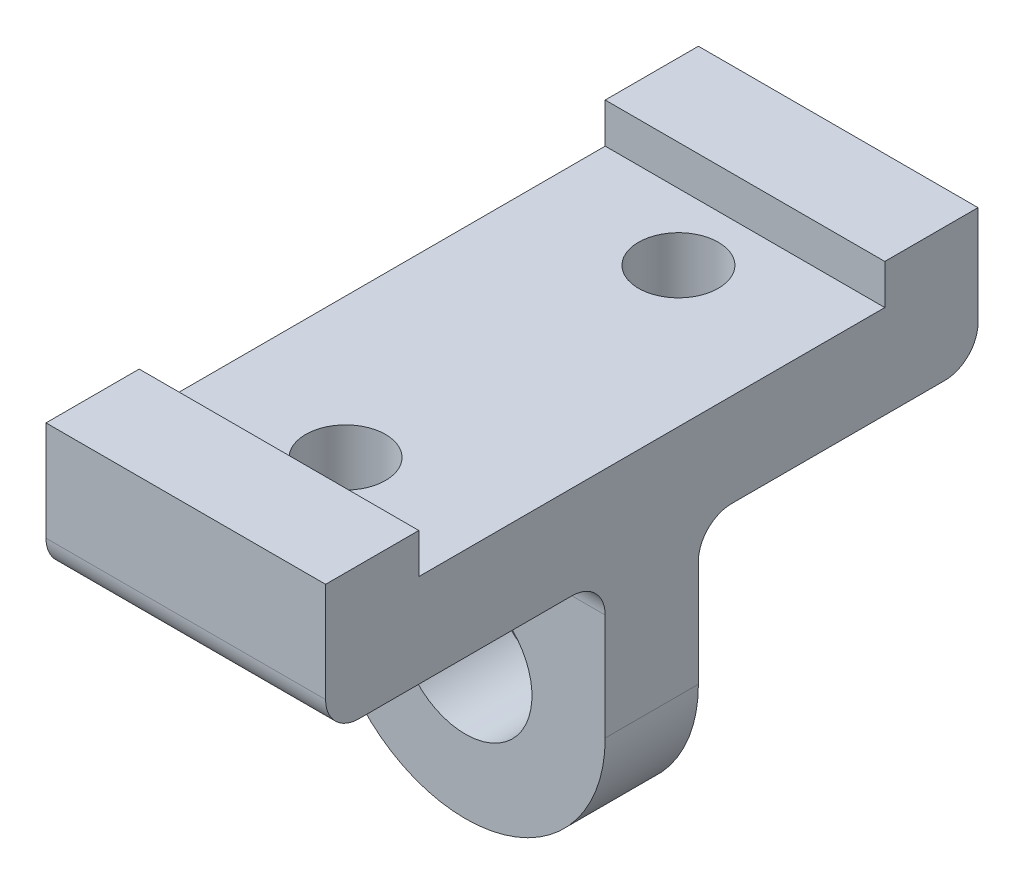
ISO-10303-21;
HEADER;
FILE_DESCRIPTION(('STEP AP214'),'2;1');
FILE_NAME('part.step','',(''),(''),'','','');
FILE_SCHEMA(('AUTOMOTIVE_DESIGN { 1 0 10303 214 1 1 1 1 }'));
ENDSEC;
DATA;
#1=APPLICATION_CONTEXT('core data for automotive mechanical design processes');
#2=APPLICATION_PROTOCOL_DEFINITION('international standard','automotive_design',2000,#1);
#3=PRODUCT_CONTEXT('',#1,'mechanical');
#4=PRODUCT('Part','Part','',(#3));
#5=PRODUCT_RELATED_PRODUCT_CATEGORY('part','',(#4));
#6=PRODUCT_DEFINITION_FORMATION('','',#4);
#7=PRODUCT_DEFINITION_CONTEXT('part definition',#1,'design');
#8=PRODUCT_DEFINITION('design','',#6,#7);
#9=PRODUCT_DEFINITION_SHAPE('','',#8);
#10=(LENGTH_UNIT() NAMED_UNIT(*) SI_UNIT(.MILLI.,.METRE.));
#11=(NAMED_UNIT(*) PLANE_ANGLE_UNIT() SI_UNIT($,.RADIAN.));
#12=(NAMED_UNIT(*) SI_UNIT($,.STERADIAN.) SOLID_ANGLE_UNIT());
#13=UNCERTAINTY_MEASURE_WITH_UNIT(LENGTH_MEASURE(1.E-05),#10,'distance_accuracy_value','');
#14=(GEOMETRIC_REPRESENTATION_CONTEXT(3) GLOBAL_UNCERTAINTY_ASSIGNED_CONTEXT((#13)) GLOBAL_UNIT_ASSIGNED_CONTEXT((#10,
#11,#12)) REPRESENTATION_CONTEXT('',''));
#15=CARTESIAN_POINT('',(0.,0.,0.));
#16=DIRECTION('',(0.,0.,1.));
#17=DIRECTION('',(1.,0.,0.));
#18=AXIS2_PLACEMENT_3D('',#15,#16,#17);
#19=CARTESIAN_POINT('',(0.,0.,0.));
#20=DIRECTION('',(0.,1.,0.));
#21=DIRECTION('',(0.,0.,1.));
#22=AXIS2_PLACEMENT_3D('',#19,#20,#21);
#23=PLANE('',#22);
#24=CARTESIAN_POINT('',(0.,0.,25.));
#25=DIRECTION('',(0.,-1.,0.));
#26=DIRECTION('',(0.,0.,-1.));
#27=AXIS2_PLACEMENT_3D('',#24,#25,#26);
#28=CIRCLE('',#27,6.);
#29=CARTESIAN_POINT('',(0.,0.,19.));
#30=VERTEX_POINT('',#29);
#31=EDGE_CURVE('E244',#30,#30,#28,.T.);
#32=ORIENTED_EDGE('',*,*,#31,.F.);
#33=EDGE_LOOP('',(#32));
#34=FACE_BOUND('',#33,.T.);
#35=DIRECTION('',(0.,0.,1.));
#36=VECTOR('',#35,1.);
#37=CARTESIAN_POINT('',(-21.,0.,49.));
#38=LINE('',#37,#36);
#39=CARTESIAN_POINT('',(-21.,0.,12.));
#40=VERTEX_POINT('',#39);
#41=CARTESIAN_POINT('',(-21.,0.,44.));
#42=VERTEX_POINT('',#41);
#43=EDGE_CURVE('E202',#40,#42,#38,.T.);
#44=ORIENTED_EDGE('',*,*,#43,.F.);
#45=DIRECTION('',(-1.,0.,0.));
#46=VECTOR('',#45,1.);
#47=CARTESIAN_POINT('',(21.,0.,12.));
#48=LINE('',#47,#46);
#49=CARTESIAN_POINT('',(21.,0.,12.));
#50=VERTEX_POINT('',#49);
#51=EDGE_CURVE('E249',#40,#50,#48,.F.);
#52=ORIENTED_EDGE('',*,*,#51,.T.);
#53=DIRECTION('',(0.,0.,-1.));
#54=VECTOR('',#53,1.);
#55=CARTESIAN_POINT('',(21.,0.,49.));
#56=LINE('',#55,#54);
#57=CARTESIAN_POINT('',(21.,0.,44.));
#58=VERTEX_POINT('',#57);
#59=EDGE_CURVE('E204',#58,#50,#56,.T.);
#60=ORIENTED_EDGE('',*,*,#59,.F.);
#61=DIRECTION('',(1.,0.,0.));
#62=VECTOR('',#61,1.);
#63=CARTESIAN_POINT('',(0.,0.,44.));
#64=LINE('',#63,#62);
#65=EDGE_CURVE('E247',#58,#42,#64,.F.);
#66=ORIENTED_EDGE('',*,*,#65,.T.);
#67=EDGE_LOOP('',(#44,#52,#60,#66));
#68=FACE_BOUND('',#67,.T.);
#69=ADVANCED_FACE('F33',(#34,#68),#23,.F.);
#70=CARTESIAN_POINT('',(0.,0.,-25.));
#71=DIRECTION('',(0.,1.,0.));
#72=DIRECTION('',(0.,0.,1.));
#73=AXIS2_PLACEMENT_3D('',#70,#71,#72);
#74=CIRCLE('',#73,6.);
#75=CARTESIAN_POINT('',(0.,0.,-31.));
#76=VERTEX_POINT('',#75);
#77=EDGE_CURVE('E240',#76,#76,#74,.T.);
#78=ORIENTED_EDGE('',*,*,#77,.T.);
#79=EDGE_LOOP('',(#78));
#80=FACE_BOUND('',#79,.T.);
#81=CARTESIAN_POINT('',(21.,0.,-12.));
#82=VERTEX_POINT('',#81);
#83=CARTESIAN_POINT('',(21.,0.,-44.));
#84=VERTEX_POINT('',#83);
#85=EDGE_CURVE('E201',#82,#84,#56,.T.);
#86=ORIENTED_EDGE('',*,*,#85,.F.);
#87=DIRECTION('',(1.,0.,0.));
#88=VECTOR('',#87,1.);
#89=CARTESIAN_POINT('',(-21.,0.,-12.));
#90=LINE('',#89,#88);
#91=CARTESIAN_POINT('',(-21.,0.,-12.));
#92=VERTEX_POINT('',#91);
#93=EDGE_CURVE('E256',#82,#92,#90,.F.);
#94=ORIENTED_EDGE('',*,*,#93,.T.);
#95=CARTESIAN_POINT('',(-21.,0.,-44.));
#96=VERTEX_POINT('',#95);
#97=EDGE_CURVE('E198',#96,#92,#38,.T.);
#98=ORIENTED_EDGE('',*,*,#97,.F.);
#99=DIRECTION('',(-1.,0.,0.));
#100=VECTOR('',#99,1.);
#101=CARTESIAN_POINT('',(0.,0.,-44.));
#102=LINE('',#101,#100);
#103=EDGE_CURVE('E254',#96,#84,#102,.F.);
#104=ORIENTED_EDGE('',*,*,#103,.T.);
#105=EDGE_LOOP('',(#86,#94,#98,#104));
#106=FACE_BOUND('',#105,.T.);
#107=ADVANCED_FACE('F281',(#80,#106),#23,.F.);
#108=CARTESIAN_POINT('',(0.,20.,0.));
#109=DIRECTION('',(0.,1.,0.));
#110=DIRECTION('',(0.,0.,1.));
#111=AXIS2_PLACEMENT_3D('',#108,#109,#110);
#112=PLANE('',#111);
#113=DIRECTION('',(-1.,0.,0.));
#114=VECTOR('',#113,1.);
#115=CARTESIAN_POINT('',(21.,20.,-35.));
#116=LINE('',#115,#114);
#117=CARTESIAN_POINT('',(21.,20.,-35.));
#118=VERTEX_POINT('',#117);
#119=CARTESIAN_POINT('',(-21.,20.,-35.));
#120=VERTEX_POINT('',#119);
#121=EDGE_CURVE('E173',#118,#120,#116,.T.);
#122=ORIENTED_EDGE('',*,*,#121,.F.);
#123=DIRECTION('',(0.,0.,-1.));
#124=VECTOR('',#123,1.);
#125=CARTESIAN_POINT('',(21.,20.,49.));
#126=LINE('',#125,#124);
#127=CARTESIAN_POINT('',(21.,20.,-49.));
#128=VERTEX_POINT('',#127);
#129=EDGE_CURVE('E191',#118,#128,#126,.T.);
#130=ORIENTED_EDGE('',*,*,#129,.T.);
#131=DIRECTION('',(-1.,0.,0.));
#132=VECTOR('',#131,1.);
#133=CARTESIAN_POINT('',(21.,20.,-49.));
#134=LINE('',#133,#132);
#135=CARTESIAN_POINT('',(-21.,20.,-49.));
#136=VERTEX_POINT('',#135);
#137=EDGE_CURVE('E195',#128,#136,#134,.T.);
#138=ORIENTED_EDGE('',*,*,#137,.T.);
#139=DIRECTION('',(0.,0.,1.));
#140=VECTOR('',#139,1.);
#141=CARTESIAN_POINT('',(-21.,20.,49.));
#142=LINE('',#141,#140);
#143=EDGE_CURVE('E186',#136,#120,#142,.T.);
#144=ORIENTED_EDGE('',*,*,#143,.T.);
#145=EDGE_LOOP('',(#122,#130,#138,#144));
#146=FACE_BOUND('',#145,.T.);
#147=ADVANCED_FACE('F308',(#146),#112,.T.);
#148=CARTESIAN_POINT('',(-21.,20.,49.));
#149=DIRECTION('',(1.,0.,0.));
#150=DIRECTION('',(0.,0.,-1.));
#151=AXIS2_PLACEMENT_3D('',#148,#149,#150);
#152=PLANE('',#151);
#153=ORIENTED_EDGE('',*,*,#43,.T.);
#154=CARTESIAN_POINT('',(-21.,5.,44.));
#155=DIRECTION('',(1.,0.,0.));
#156=DIRECTION('',(0.,0.,-1.));
#157=AXIS2_PLACEMENT_3D('',#154,#155,#156);
#158=CIRCLE('',#157,5.);
#159=CARTESIAN_POINT('',(-21.,5.,49.));
#160=VERTEX_POINT('',#159);
#161=EDGE_CURVE('E265',#42,#160,#158,.F.);
#162=ORIENTED_EDGE('',*,*,#161,.T.);
#163=DIRECTION('',(0.,-1.,0.));
#164=VECTOR('',#163,1.);
#165=CARTESIAN_POINT('',(-21.,20.,49.));
#166=LINE('',#165,#164);
#167=CARTESIAN_POINT('',(-21.,20.,49.));
#168=VERTEX_POINT('',#167);
#169=EDGE_CURVE('E212',#168,#160,#166,.T.);
#170=ORIENTED_EDGE('',*,*,#169,.F.);
#171=CARTESIAN_POINT('',(-21.,20.,35.0000000000001));
#172=VERTEX_POINT('',#171);
#173=EDGE_CURVE('E179',#172,#168,#142,.T.);
#174=ORIENTED_EDGE('',*,*,#173,.F.);
#175=DIRECTION('',(0.,1.,0.));
#176=VECTOR('',#175,1.);
#177=CARTESIAN_POINT('',(-21.,14.,35.0000000000001));
#178=LINE('',#177,#176);
#179=CARTESIAN_POINT('',(-21.,14.,35.0000000000001));
#180=VERTEX_POINT('',#179);
#181=EDGE_CURVE('E157',#180,#172,#178,.T.);
#182=ORIENTED_EDGE('',*,*,#181,.F.);
#183=DIRECTION('',(0.,0.,1.));
#184=VECTOR('',#183,1.);
#185=CARTESIAN_POINT('',(-21.,14.,35.0000000000001));
#186=LINE('',#185,#184);
#187=CARTESIAN_POINT('',(-21.,14.,-35.));
#188=VERTEX_POINT('',#187);
#189=EDGE_CURVE('E164',#188,#180,#186,.T.);
#190=ORIENTED_EDGE('',*,*,#189,.F.);
#191=DIRECTION('',(0.,1.,0.));
#192=VECTOR('',#191,1.);
#193=CARTESIAN_POINT('',(-21.,14.,-35.));
#194=LINE('',#193,#192);
#195=EDGE_CURVE('E301',#188,#120,#194,.T.);
#196=ORIENTED_EDGE('',*,*,#195,.T.);
#197=ORIENTED_EDGE('',*,*,#143,.F.);
#198=DIRECTION('',(0.,-1.,0.));
#199=VECTOR('',#198,1.);
#200=CARTESIAN_POINT('',(-21.,20.,-49.));
#201=LINE('',#200,#199);
#202=CARTESIAN_POINT('',(-21.,5.,-49.));
#203=VERTEX_POINT('',#202);
#204=EDGE_CURVE('E197',#136,#203,#201,.T.);
#205=ORIENTED_EDGE('',*,*,#204,.T.);
#206=CARTESIAN_POINT('',(-21.,5.,-44.));
#207=DIRECTION('',(1.,0.,0.));
#208=DIRECTION('',(0.,0.,-1.));
#209=AXIS2_PLACEMENT_3D('',#206,#207,#208);
#210=CIRCLE('',#209,5.);
#211=EDGE_CURVE('E48',#203,#96,#210,.F.);
#212=ORIENTED_EDGE('',*,*,#211,.T.);
#213=ORIENTED_EDGE('',*,*,#97,.T.);
#214=CARTESIAN_POINT('',(-21.,-5.,-12.));
#215=DIRECTION('',(1.,0.,0.));
#216=DIRECTION('',(0.,0.,-1.));
#217=AXIS2_PLACEMENT_3D('',#214,#215,#216);
#218=CIRCLE('',#217,5.);
#219=CARTESIAN_POINT('',(-21.,-5.00000000000001,-7.));
#220=VERTEX_POINT('',#219);
#221=EDGE_CURVE('E11',#92,#220,#218,.T.);
#222=ORIENTED_EDGE('',*,*,#221,.T.);
#223=DIRECTION('',(0.,1.,0.));
#224=VECTOR('',#223,1.);
#225=CARTESIAN_POINT('',(-21.,-42.,-7.));
#226=LINE('',#225,#224);
#227=CARTESIAN_POINT('',(-21.,-21.,-7.));
#228=VERTEX_POINT('',#227);
#229=EDGE_CURVE('E287',#228,#220,#226,.T.);
#230=ORIENTED_EDGE('',*,*,#229,.F.);
#231=DIRECTION('',(0.,0.,-1.));
#232=VECTOR('',#231,1.);
#233=CARTESIAN_POINT('',(-21.,-21.,7.));
#234=LINE('',#233,#232);
#235=CARTESIAN_POINT('',(-21.,-21.,7.));
#236=VERTEX_POINT('',#235);
#237=EDGE_CURVE('E226',#228,#236,#234,.F.);
#238=ORIENTED_EDGE('',*,*,#237,.T.);
#239=DIRECTION('',(0.,1.,0.));
#240=VECTOR('',#239,1.);
#241=CARTESIAN_POINT('',(-21.,-42.,7.));
#242=LINE('',#241,#240);
#243=CARTESIAN_POINT('',(-21.,-5.00000000000001,7.));
#244=VERTEX_POINT('',#243);
#245=EDGE_CURVE('E232',#236,#244,#242,.T.);
#246=ORIENTED_EDGE('',*,*,#245,.T.);
#247=CARTESIAN_POINT('',(-21.,-5.,12.));
#248=DIRECTION('',(1.,0.,0.));
#249=DIRECTION('',(0.,0.,-1.));
#250=AXIS2_PLACEMENT_3D('',#247,#248,#249);
#251=CIRCLE('',#250,5.);
#252=EDGE_CURVE('E269',#244,#40,#251,.T.);
#253=ORIENTED_EDGE('',*,*,#252,.T.);
#254=EDGE_LOOP('',(#153,#162,#170,#174,#182,#190,#196,#197,#205,#212,#213,#222,#230,#238,#246,#253));
#255=FACE_BOUND('',#254,.T.);
#256=ADVANCED_FACE('F177',(#255),#152,.F.);
#257=CARTESIAN_POINT('',(21.,20.,49.));
#258=DIRECTION('',(0.,0.,-1.));
#259=DIRECTION('',(-1.,0.,0.));
#260=AXIS2_PLACEMENT_3D('',#257,#258,#259);
#261=PLANE('',#260);
#262=ORIENTED_EDGE('',*,*,#169,.T.);
#263=DIRECTION('',(1.,0.,0.));
#264=VECTOR('',#263,1.);
#265=CARTESIAN_POINT('',(21.,5.,49.));
#266=LINE('',#265,#264);
#267=CARTESIAN_POINT('',(21.,5.,49.));
#268=VERTEX_POINT('',#267);
#269=EDGE_CURVE('E258',#160,#268,#266,.T.);
#270=ORIENTED_EDGE('',*,*,#269,.T.);
#271=DIRECTION('',(0.,-1.,0.));
#272=VECTOR('',#271,1.);
#273=CARTESIAN_POINT('',(21.,20.,49.));
#274=LINE('',#273,#272);
#275=CARTESIAN_POINT('',(21.,20.,49.));
#276=VERTEX_POINT('',#275);
#277=EDGE_CURVE('E209',#276,#268,#274,.T.);
#278=ORIENTED_EDGE('',*,*,#277,.F.);
#279=DIRECTION('',(1.,0.,0.));
#280=VECTOR('',#279,1.);
#281=CARTESIAN_POINT('',(21.,20.,49.));
#282=LINE('',#281,#280);
#283=EDGE_CURVE('E189',#168,#276,#282,.T.);
#284=ORIENTED_EDGE('',*,*,#283,.F.);
#285=EDGE_LOOP('',(#262,#270,#278,#284));
#286=FACE_BOUND('',#285,.T.);
#287=ADVANCED_FACE('F337',(#286),#261,.F.);
#288=CARTESIAN_POINT('',(21.,20.,49.));
#289=DIRECTION('',(-1.,0.,0.));
#290=DIRECTION('',(0.,0.,1.));
#291=AXIS2_PLACEMENT_3D('',#288,#289,#290);
#292=PLANE('',#291);
#293=ORIENTED_EDGE('',*,*,#277,.T.);
#294=CARTESIAN_POINT('',(21.,5.,44.));
#295=DIRECTION('',(-1.,0.,0.));
#296=DIRECTION('',(0.,0.,1.));
#297=AXIS2_PLACEMENT_3D('',#294,#295,#296);
#298=CIRCLE('',#297,5.);
#299=EDGE_CURVE('E262',#268,#58,#298,.F.);
#300=ORIENTED_EDGE('',*,*,#299,.T.);
#301=ORIENTED_EDGE('',*,*,#59,.T.);
#302=CARTESIAN_POINT('',(21.,-5.,12.));
#303=DIRECTION('',(-1.,0.,0.));
#304=DIRECTION('',(0.,0.,1.));
#305=AXIS2_PLACEMENT_3D('',#302,#303,#304);
#306=CIRCLE('',#305,5.);
#307=CARTESIAN_POINT('',(21.,-5.00000000000001,7.));
#308=VERTEX_POINT('',#307);
#309=EDGE_CURVE('E271',#50,#308,#306,.T.);
#310=ORIENTED_EDGE('',*,*,#309,.T.);
#311=DIRECTION('',(0.,1.,0.));
#312=VECTOR('',#311,1.);
#313=CARTESIAN_POINT('',(21.,-42.,7.));
#314=LINE('',#313,#312);
#315=CARTESIAN_POINT('',(21.,-21.,7.));
#316=VERTEX_POINT('',#315);
#317=EDGE_CURVE('E295',#316,#308,#314,.T.);
#318=ORIENTED_EDGE('',*,*,#317,.F.);
#319=DIRECTION('',(0.,0.,1.));
#320=VECTOR('',#319,1.);
#321=CARTESIAN_POINT('',(21.,-21.,-7.));
#322=LINE('',#321,#320);
#323=CARTESIAN_POINT('',(21.,-21.,-7.));
#324=VERTEX_POINT('',#323);
#325=EDGE_CURVE('E219',#316,#324,#322,.F.);
#326=ORIENTED_EDGE('',*,*,#325,.T.);
#327=DIRECTION('',(0.,1.,0.));
#328=VECTOR('',#327,1.);
#329=CARTESIAN_POINT('',(21.,-42.,-7.));
#330=LINE('',#329,#328);
#331=CARTESIAN_POINT('',(21.,-5.00000000000001,-7.));
#332=VERTEX_POINT('',#331);
#333=EDGE_CURVE('E276',#324,#332,#330,.T.);
#334=ORIENTED_EDGE('',*,*,#333,.T.);
#335=CARTESIAN_POINT('',(21.,-5.,-12.));
#336=DIRECTION('',(-1.,0.,0.));
#337=DIRECTION('',(0.,0.,1.));
#338=AXIS2_PLACEMENT_3D('',#335,#336,#337);
#339=CIRCLE('',#338,5.);
#340=EDGE_CURVE('E41',#332,#82,#339,.T.);
#341=ORIENTED_EDGE('',*,*,#340,.T.);
#342=ORIENTED_EDGE('',*,*,#85,.T.);
#343=CARTESIAN_POINT('',(21.,5.,-44.));
#344=DIRECTION('',(-1.,0.,0.));
#345=DIRECTION('',(0.,0.,1.));
#346=AXIS2_PLACEMENT_3D('',#343,#344,#345);
#347=CIRCLE('',#346,5.);
#348=CARTESIAN_POINT('',(21.,5.,-49.));
#349=VERTEX_POINT('',#348);
#350=EDGE_CURVE('E56',#84,#349,#347,.F.);
#351=ORIENTED_EDGE('',*,*,#350,.T.);
#352=DIRECTION('',(0.,-1.,0.));
#353=VECTOR('',#352,1.);
#354=CARTESIAN_POINT('',(21.,20.,-49.));
#355=LINE('',#354,#353);
#356=EDGE_CURVE('E207',#128,#349,#355,.T.);
#357=ORIENTED_EDGE('',*,*,#356,.F.);
#358=ORIENTED_EDGE('',*,*,#129,.F.);
#359=DIRECTION('',(0.,1.,0.));
#360=VECTOR('',#359,1.);
#361=CARTESIAN_POINT('',(21.,14.,-35.));
#362=LINE('',#361,#360);
#363=CARTESIAN_POINT('',(21.,14.,-35.));
#364=VERTEX_POINT('',#363);
#365=EDGE_CURVE('E181',#364,#118,#362,.T.);
#366=ORIENTED_EDGE('',*,*,#365,.F.);
#367=DIRECTION('',(0.,0.,-1.));
#368=VECTOR('',#367,1.);
#369=CARTESIAN_POINT('',(21.,14.,35.0000000000001));
#370=LINE('',#369,#368);
#371=CARTESIAN_POINT('',(21.,14.,35.0000000000001));
#372=VERTEX_POINT('',#371);
#373=EDGE_CURVE('E163',#372,#364,#370,.T.);
#374=ORIENTED_EDGE('',*,*,#373,.F.);
#375=DIRECTION('',(0.,1.,0.));
#376=VECTOR('',#375,1.);
#377=CARTESIAN_POINT('',(21.,14.,35.0000000000001));
#378=LINE('',#377,#376);
#379=CARTESIAN_POINT('',(21.,20.,35.0000000000001));
#380=VERTEX_POINT('',#379);
#381=EDGE_CURVE('E160',#372,#380,#378,.T.);
#382=ORIENTED_EDGE('',*,*,#381,.T.);
#383=EDGE_CURVE('E192',#276,#380,#126,.T.);
#384=ORIENTED_EDGE('',*,*,#383,.F.);
#385=EDGE_LOOP('',(#293,#300,#301,#310,#318,#326,#334,#341,#342,#351,#357,#358,#366,#374,#382,#384));
#386=FACE_BOUND('',#385,.T.);
#387=ADVANCED_FACE('F274',(#386),#292,.F.);
#388=CARTESIAN_POINT('',(21.,20.,-49.));
#389=DIRECTION('',(0.,0.,1.));
#390=DIRECTION('',(1.,0.,0.));
#391=AXIS2_PLACEMENT_3D('',#388,#389,#390);
#392=PLANE('',#391);
#393=ORIENTED_EDGE('',*,*,#356,.T.);
#394=DIRECTION('',(-1.,0.,0.));
#395=VECTOR('',#394,1.);
#396=CARTESIAN_POINT('',(21.,5.,-49.));
#397=LINE('',#396,#395);
#398=EDGE_CURVE('E267',#349,#203,#397,.T.);
#399=ORIENTED_EDGE('',*,*,#398,.T.);
#400=ORIENTED_EDGE('',*,*,#204,.F.);
#401=ORIENTED_EDGE('',*,*,#137,.F.);
#402=EDGE_LOOP('',(#393,#399,#400,#401));
#403=FACE_BOUND('',#402,.T.);
#404=ADVANCED_FACE('F313',(#403),#392,.F.);
#405=DIRECTION('',(1.,0.,0.));
#406=VECTOR('',#405,1.);
#407=CARTESIAN_POINT('',(21.,20.,35.0000000000001));
#408=LINE('',#407,#406);
#409=EDGE_CURVE('E292',#172,#380,#408,.T.);
#410=ORIENTED_EDGE('',*,*,#409,.F.);
#411=ORIENTED_EDGE('',*,*,#173,.T.);
#412=ORIENTED_EDGE('',*,*,#283,.T.);
#413=ORIENTED_EDGE('',*,*,#383,.T.);
#414=EDGE_LOOP('',(#410,#411,#412,#413));
#415=FACE_BOUND('',#414,.T.);
#416=ADVANCED_FACE('F331',(#415),#112,.T.);
#417=CARTESIAN_POINT('',(21.,14.,-35.));
#418=DIRECTION('',(0.,0.,-1.));
#419=DIRECTION('',(-1.,0.,0.));
#420=AXIS2_PLACEMENT_3D('',#417,#418,#419);
#421=PLANE('',#420);
#422=ORIENTED_EDGE('',*,*,#121,.T.);
#423=ORIENTED_EDGE('',*,*,#195,.F.);
#424=DIRECTION('',(-1.,0.,0.));
#425=VECTOR('',#424,1.);
#426=CARTESIAN_POINT('',(21.,14.,-35.));
#427=LINE('',#426,#425);
#428=EDGE_CURVE('E170',#364,#188,#427,.T.);
#429=ORIENTED_EDGE('',*,*,#428,.F.);
#430=ORIENTED_EDGE('',*,*,#365,.T.);
#431=EDGE_LOOP('',(#422,#423,#429,#430));
#432=FACE_BOUND('',#431,.T.);
#433=ADVANCED_FACE('F305',(#432),#421,.F.);
#434=CARTESIAN_POINT('',(21.,14.,35.0000000000001));
#435=DIRECTION('',(0.,0.,1.));
#436=DIRECTION('',(1.,0.,0.));
#437=AXIS2_PLACEMENT_3D('',#434,#435,#436);
#438=PLANE('',#437);
#439=ORIENTED_EDGE('',*,*,#409,.T.);
#440=ORIENTED_EDGE('',*,*,#381,.F.);
#441=DIRECTION('',(1.,0.,0.));
#442=VECTOR('',#441,1.);
#443=CARTESIAN_POINT('',(21.,14.,35.0000000000001));
#444=LINE('',#443,#442);
#445=EDGE_CURVE('E153',#180,#372,#444,.T.);
#446=ORIENTED_EDGE('',*,*,#445,.F.);
#447=ORIENTED_EDGE('',*,*,#181,.T.);
#448=EDGE_LOOP('',(#439,#440,#446,#447));
#449=FACE_BOUND('',#448,.T.);
#450=ADVANCED_FACE('F155',(#449),#438,.F.);
#451=CARTESIAN_POINT('',(0.,14.,0.));
#452=DIRECTION('',(0.,1.,0.));
#453=DIRECTION('',(0.,0.,1.));
#454=AXIS2_PLACEMENT_3D('',#451,#452,#453);
#455=PLANE('',#454);
#456=CARTESIAN_POINT('',(0.,14.,25.));
#457=DIRECTION('',(0.,1.,0.));
#458=DIRECTION('',(0.,0.,1.));
#459=AXIS2_PLACEMENT_3D('',#456,#457,#458);
#460=CIRCLE('',#459,6.);
#461=CARTESIAN_POINT('',(0.,14.,19.));
#462=VERTEX_POINT('',#461);
#463=EDGE_CURVE('E241',#462,#462,#460,.T.);
#464=ORIENTED_EDGE('',*,*,#463,.F.);
#465=EDGE_LOOP('',(#464));
#466=FACE_BOUND('',#465,.T.);
#467=CARTESIAN_POINT('',(0.,14.,-25.));
#468=DIRECTION('',(0.,1.,0.));
#469=DIRECTION('',(0.,0.,1.));
#470=AXIS2_PLACEMENT_3D('',#467,#468,#469);
#471=CIRCLE('',#470,6.);
#472=CARTESIAN_POINT('',(0.,14.,-31.));
#473=VERTEX_POINT('',#472);
#474=EDGE_CURVE('E237',#473,#473,#471,.F.);
#475=ORIENTED_EDGE('',*,*,#474,.T.);
#476=EDGE_LOOP('',(#475));
#477=FACE_BOUND('',#476,.T.);
#478=ORIENTED_EDGE('',*,*,#189,.T.);
#479=ORIENTED_EDGE('',*,*,#445,.T.);
#480=ORIENTED_EDGE('',*,*,#373,.T.);
#481=ORIENTED_EDGE('',*,*,#428,.T.);
#482=EDGE_LOOP('',(#478,#479,#480,#481));
#483=FACE_BOUND('',#482,.T.);
#484=ADVANCED_FACE('F168',(#466,#477,#483),#455,.T.);
#485=CARTESIAN_POINT('',(21.,-42.,-7.));
#486=DIRECTION('',(0.,0.,1.));
#487=DIRECTION('',(1.,0.,0.));
#488=AXIS2_PLACEMENT_3D('',#485,#486,#487);
#489=PLANE('',#488);
#490=CARTESIAN_POINT('',(0.,-21.,-7.));
#491=DIRECTION('',(0.,0.,1.));
#492=DIRECTION('',(1.,0.,0.));
#493=AXIS2_PLACEMENT_3D('',#490,#491,#492);
#494=CIRCLE('',#493,10.);
#495=CARTESIAN_POINT('',(-10.,-21.,-7.00000000000001));
#496=VERTEX_POINT('',#495);
#497=EDGE_CURVE('E233',#496,#496,#494,.T.);
#498=ORIENTED_EDGE('',*,*,#497,.T.);
#499=EDGE_LOOP('',(#498));
#500=FACE_BOUND('',#499,.T.);
#501=ORIENTED_EDGE('',*,*,#229,.T.);
#502=DIRECTION('',(1.,0.,0.));
#503=VECTOR('',#502,1.);
#504=CARTESIAN_POINT('',(21.,-5.,-7.));
#505=LINE('',#504,#503);
#506=EDGE_CURVE('E251',#220,#332,#505,.T.);
#507=ORIENTED_EDGE('',*,*,#506,.T.);
#508=ORIENTED_EDGE('',*,*,#333,.F.);
#509=CARTESIAN_POINT('',(0.,-21.,-7.));
#510=DIRECTION('',(0.,0.,1.));
#511=DIRECTION('',(1.,0.,0.));
#512=AXIS2_PLACEMENT_3D('',#509,#510,#511);
#513=CIRCLE('',#512,21.);
#514=CARTESIAN_POINT('',(0.,-42.,-7.));
#515=VERTEX_POINT('',#514);
#516=EDGE_CURVE('E224',#324,#515,#513,.F.);
#517=ORIENTED_EDGE('',*,*,#516,.T.);
#518=CARTESIAN_POINT('',(0.,-21.,-7.));
#519=DIRECTION('',(0.,0.,1.));
#520=DIRECTION('',(1.,0.,0.));
#521=AXIS2_PLACEMENT_3D('',#518,#519,#520);
#522=CIRCLE('',#521,21.);
#523=EDGE_CURVE('E222',#515,#228,#522,.F.);
#524=ORIENTED_EDGE('',*,*,#523,.T.);
#525=EDGE_LOOP('',(#501,#507,#508,#517,#524));
#526=FACE_BOUND('',#525,.T.);
#527=ADVANCED_FACE('F290',(#500,#526),#489,.F.);
#528=CARTESIAN_POINT('',(21.,-42.,7.));
#529=DIRECTION('',(0.,0.,-1.));
#530=DIRECTION('',(-1.,0.,0.));
#531=AXIS2_PLACEMENT_3D('',#528,#529,#530);
#532=PLANE('',#531);
#533=CARTESIAN_POINT('',(0.,-21.,7.));
#534=DIRECTION('',(0.,0.,-1.));
#535=DIRECTION('',(-1.,0.,0.));
#536=AXIS2_PLACEMENT_3D('',#533,#534,#535);
#537=CIRCLE('',#536,10.);
#538=CARTESIAN_POINT('',(-10.,-21.,7.00000000000001));
#539=VERTEX_POINT('',#538);
#540=EDGE_CURVE('E234',#539,#539,#537,.T.);
#541=ORIENTED_EDGE('',*,*,#540,.T.);
#542=EDGE_LOOP('',(#541));
#543=FACE_BOUND('',#542,.T.);
#544=ORIENTED_EDGE('',*,*,#317,.T.);
#545=DIRECTION('',(-1.,0.,0.));
#546=VECTOR('',#545,1.);
#547=CARTESIAN_POINT('',(-21.,-5.,7.));
#548=LINE('',#547,#546);
#549=EDGE_CURVE('E228',#308,#244,#548,.T.);
#550=ORIENTED_EDGE('',*,*,#549,.T.);
#551=ORIENTED_EDGE('',*,*,#245,.F.);
#552=CARTESIAN_POINT('',(0.,-21.,7.));
#553=DIRECTION('',(0.,0.,-1.));
#554=DIRECTION('',(-1.,0.,0.));
#555=AXIS2_PLACEMENT_3D('',#552,#553,#554);
#556=CIRCLE('',#555,21.);
#557=CARTESIAN_POINT('',(0.,-42.,7.));
#558=VERTEX_POINT('',#557);
#559=EDGE_CURVE('E215',#236,#558,#556,.F.);
#560=ORIENTED_EDGE('',*,*,#559,.T.);
#561=CARTESIAN_POINT('',(0.,-21.,7.));
#562=DIRECTION('',(0.,0.,-1.));
#563=DIRECTION('',(-1.,0.,0.));
#564=AXIS2_PLACEMENT_3D('',#561,#562,#563);
#565=CIRCLE('',#564,21.);
#566=EDGE_CURVE('E217',#558,#316,#565,.F.);
#567=ORIENTED_EDGE('',*,*,#566,.T.);
#568=EDGE_LOOP('',(#544,#550,#551,#560,#567));
#569=FACE_BOUND('',#568,.T.);
#570=ADVANCED_FACE('F351',(#543,#569),#532,.F.);
#571=CARTESIAN_POINT('',(0.,-21.,0.));
#572=DIRECTION('',(0.,0.,1.));
#573=DIRECTION('',(1.,0.,0.));
#574=AXIS2_PLACEMENT_3D('',#571,#572,#573);
#575=CYLINDRICAL_SURFACE('',#574,21.);
#576=ORIENTED_EDGE('',*,*,#237,.F.);
#577=ORIENTED_EDGE('',*,*,#523,.F.);
#578=DIRECTION('',(0.,0.,-1.));
#579=VECTOR('',#578,1.);
#580=CARTESIAN_POINT('',(0.,-42.,-7.));
#581=LINE('',#580,#579);
#582=EDGE_CURVE('E229',#558,#515,#581,.T.);
#583=ORIENTED_EDGE('',*,*,#582,.F.);
#584=ORIENTED_EDGE('',*,*,#559,.F.);
#585=EDGE_LOOP('',(#576,#577,#583,#584));
#586=FACE_BOUND('',#585,.T.);
#587=ADVANCED_FACE('F347',(#586),#575,.T.);
#588=CARTESIAN_POINT('',(0.,-21.,0.));
#589=DIRECTION('',(0.,0.,-1.));
#590=DIRECTION('',(-1.,0.,0.));
#591=AXIS2_PLACEMENT_3D('',#588,#589,#590);
#592=CYLINDRICAL_SURFACE('',#591,21.);
#593=ORIENTED_EDGE('',*,*,#516,.F.);
#594=ORIENTED_EDGE('',*,*,#325,.F.);
#595=ORIENTED_EDGE('',*,*,#566,.F.);
#596=ORIENTED_EDGE('',*,*,#582,.T.);
#597=EDGE_LOOP('',(#593,#594,#595,#596));
#598=FACE_BOUND('',#597,.T.);
#599=ADVANCED_FACE('F343',(#598),#592,.T.);
#600=CARTESIAN_POINT('',(0.,-21.,49.));
#601=DIRECTION('',(0.,0.,-1.));
#602=DIRECTION('',(-1.,0.,0.));
#603=AXIS2_PLACEMENT_3D('',#600,#601,#602);
#604=CYLINDRICAL_SURFACE('',#603,10.);
#605=CARTESIAN_POINT('',(-10.,-21.,7.00000000000001));
#606=CARTESIAN_POINT('',(-10.,-21.,6.85416666666667));
#607=CARTESIAN_POINT('',(-10.,-21.,6.70833333333334));
#608=CARTESIAN_POINT('',(-10.,-21.,6.41666666666667));
#609=CARTESIAN_POINT('',(-10.,-21.,6.27083333333334));
#610=CARTESIAN_POINT('',(-10.,-21.,5.97916666666667));
#611=CARTESIAN_POINT('',(-10.,-21.,5.83333333333334));
#612=CARTESIAN_POINT('',(-10.,-21.,5.54166666666667));
#613=CARTESIAN_POINT('',(-10.,-21.,5.39583333333334));
#614=CARTESIAN_POINT('',(-10.,-21.,5.10416666666667));
#615=CARTESIAN_POINT('',(-10.,-21.,4.95833333333334));
#616=CARTESIAN_POINT('',(-10.,-21.,4.66666666666667));
#617=CARTESIAN_POINT('',(-10.,-21.,4.52083333333334));
#618=CARTESIAN_POINT('',(-10.,-21.,4.22916666666667));
#619=CARTESIAN_POINT('',(-10.,-21.,4.08333333333334));
#620=CARTESIAN_POINT('',(-10.,-21.,3.79166666666667));
#621=CARTESIAN_POINT('',(-10.,-21.,3.64583333333334));
#622=CARTESIAN_POINT('',(-10.,-21.,3.35416666666667));
#623=CARTESIAN_POINT('',(-10.,-21.,3.20833333333334));
#624=CARTESIAN_POINT('',(-10.,-21.,2.91666666666667));
#625=CARTESIAN_POINT('',(-10.,-21.,2.77083333333334));
#626=CARTESIAN_POINT('',(-10.,-21.,2.47916666666667));
#627=CARTESIAN_POINT('',(-10.,-21.,2.33333333333334));
#628=CARTESIAN_POINT('',(-10.,-21.,2.04166666666667));
#629=CARTESIAN_POINT('',(-10.,-21.,1.89583333333333));
#630=CARTESIAN_POINT('',(-10.,-21.,1.60416666666667));
#631=CARTESIAN_POINT('',(-10.,-21.,1.45833333333333));
#632=CARTESIAN_POINT('',(-10.,-21.,1.16666666666667));
#633=CARTESIAN_POINT('',(-10.,-21.,1.02083333333333));
#634=CARTESIAN_POINT('',(-10.,-21.,0.729166666666667));
#635=CARTESIAN_POINT('',(-10.,-21.,0.583333333333334));
#636=CARTESIAN_POINT('',(-10.,-21.,0.291666666666667));
#637=CARTESIAN_POINT('',(-10.,-21.,0.145833333333333));
#638=CARTESIAN_POINT('',(-10.,-21.,-0.145833333333333));
#639=CARTESIAN_POINT('',(-10.,-21.,-0.291666666666667));
#640=CARTESIAN_POINT('',(-10.,-21.,-0.583333333333334));
#641=CARTESIAN_POINT('',(-10.,-21.,-0.729166666666667));
#642=CARTESIAN_POINT('',(-10.,-21.,-1.02083333333333));
#643=CARTESIAN_POINT('',(-10.,-21.,-1.16666666666667));
#644=CARTESIAN_POINT('',(-10.,-21.,-1.45833333333333));
#645=CARTESIAN_POINT('',(-10.,-21.,-1.60416666666667));
#646=CARTESIAN_POINT('',(-10.,-21.,-1.89583333333333));
#647=CARTESIAN_POINT('',(-10.,-21.,-2.04166666666667));
#648=CARTESIAN_POINT('',(-10.,-21.,-2.33333333333334));
#649=CARTESIAN_POINT('',(-10.,-21.,-2.47916666666667));
#650=CARTESIAN_POINT('',(-10.,-21.,-2.77083333333334));
#651=CARTESIAN_POINT('',(-10.,-21.,-2.91666666666667));
#652=CARTESIAN_POINT('',(-10.,-21.,-3.20833333333334));
#653=CARTESIAN_POINT('',(-10.,-21.,-3.35416666666667));
#654=CARTESIAN_POINT('',(-10.,-21.,-3.64583333333334));
#655=CARTESIAN_POINT('',(-10.,-21.,-3.79166666666667));
#656=CARTESIAN_POINT('',(-10.,-21.,-4.08333333333334));
#657=CARTESIAN_POINT('',(-10.,-21.,-4.22916666666667));
#658=CARTESIAN_POINT('',(-10.,-21.,-4.52083333333334));
#659=CARTESIAN_POINT('',(-10.,-21.,-4.66666666666667));
#660=CARTESIAN_POINT('',(-10.,-21.,-4.95833333333334));
#661=CARTESIAN_POINT('',(-10.,-21.,-5.10416666666667));
#662=CARTESIAN_POINT('',(-10.,-21.,-5.39583333333334));
#663=CARTESIAN_POINT('',(-10.,-21.,-5.54166666666667));
#664=CARTESIAN_POINT('',(-10.,-21.,-5.83333333333334));
#665=CARTESIAN_POINT('',(-10.,-21.,-5.97916666666667));
#666=CARTESIAN_POINT('',(-10.,-21.,-6.27083333333334));
#667=CARTESIAN_POINT('',(-10.,-21.,-6.41666666666667));
#668=CARTESIAN_POINT('',(-10.,-21.,-6.70833333333334));
#669=CARTESIAN_POINT('',(-10.,-21.,-6.85416666666667));
#670=CARTESIAN_POINT('',(-10.,-21.,-7.00000000000001));
#671=B_SPLINE_CURVE_WITH_KNOTS('',3,(#605,#606,#607,#608,#609,#610,#611,#612,#613,#614,#615,
#616,#617,#618,#619,#620,#621,#622,#623,#624,#625,#626,#627,#628,#629,#630,#631,#632,#633,#634,
#635,#636,#637,#638,#639,#640,#641,#642,#643,#644,#645,#646,#647,#648,#649,#650,#651,#652,#653,
#654,#655,#656,#657,#658,#659,#660,#661,#662,#663,#664,#665,#666,#667,#668,#669,#670),
.UNSPECIFIED.,.F.,.F.,(4,2,2,2,2,2,2,2,2,2,2,2,2,2,2,2,2,2,2,2,2,2,2,2,2,2,2,2,2,2,2,2,4),(0.,
0.4375,0.875000000000001,1.3125,1.75,2.1875,2.625,3.0625,3.5,3.9375,4.375,4.8125,5.25,
5.68750000000001,6.12500000000001,6.56250000000001,7.00000000000001,7.43750000000001,
7.87500000000001,8.31250000000001,8.75000000000001,9.18750000000001,9.62500000000001,10.0625,
10.5,10.9375,11.375,11.8125,12.25,12.6875,13.125,13.5625,14.),.UNSPECIFIED.);
#672=EDGE_CURVE('BSEAM346',#539,#496,#671,.T.);
#673=ORIENTED_EDGE('',*,*,#540,.F.);
#674=ORIENTED_EDGE('',*,*,#497,.F.);
#675=ORIENTED_EDGE('',*,*,#672,.T.);
#676=ORIENTED_EDGE('',*,*,#672,.F.);
#677=EDGE_LOOP('',(#673,#675,#674,#676));
#678=FACE_BOUND('',#677,.T.);
#679=ADVANCED_FACE('F346',(#678),#604,.F.);
#680=CARTESIAN_POINT('',(0.,42.,-25.));
#681=DIRECTION('',(0.,-1.,0.));
#682=DIRECTION('',(0.,0.,-1.));
#683=AXIS2_PLACEMENT_3D('',#680,#681,#682);
#684=CYLINDRICAL_SURFACE('',#683,6.);
#685=CARTESIAN_POINT('',(0.,14.,-31.));
#686=CARTESIAN_POINT('',(0.,13.8541666666667,-31.));
#687=CARTESIAN_POINT('',(0.,13.7083333333333,-31.));
#688=CARTESIAN_POINT('',(0.,13.4166666666667,-31.));
#689=CARTESIAN_POINT('',(0.,13.2708333333333,-31.));
#690=CARTESIAN_POINT('',(0.,12.9791666666667,-31.));
#691=CARTESIAN_POINT('',(0.,12.8333333333333,-31.));
#692=CARTESIAN_POINT('',(0.,12.5416666666667,-31.));
#693=CARTESIAN_POINT('',(0.,12.3958333333333,-31.));
#694=CARTESIAN_POINT('',(0.,12.1041666666667,-31.));
#695=CARTESIAN_POINT('',(0.,11.9583333333333,-31.));
#696=CARTESIAN_POINT('',(0.,11.6666666666667,-31.));
#697=CARTESIAN_POINT('',(0.,11.5208333333333,-31.));
#698=CARTESIAN_POINT('',(0.,11.2291666666667,-31.));
#699=CARTESIAN_POINT('',(0.,11.0833333333333,-31.));
#700=CARTESIAN_POINT('',(0.,10.7916666666667,-31.));
#701=CARTESIAN_POINT('',(0.,10.6458333333333,-31.));
#702=CARTESIAN_POINT('',(0.,10.3541666666667,-31.));
#703=CARTESIAN_POINT('',(0.,10.2083333333333,-31.));
#704=CARTESIAN_POINT('',(0.,9.91666666666667,-31.));
#705=CARTESIAN_POINT('',(0.,9.77083333333333,-31.));
#706=CARTESIAN_POINT('',(0.,9.47916666666667,-31.));
#707=CARTESIAN_POINT('',(0.,9.33333333333333,-31.));
#708=CARTESIAN_POINT('',(0.,9.04166666666667,-31.));
#709=CARTESIAN_POINT('',(0.,8.89583333333333,-31.));
#710=CARTESIAN_POINT('',(0.,8.60416666666667,-31.));
#711=CARTESIAN_POINT('',(0.,8.45833333333333,-31.));
#712=CARTESIAN_POINT('',(0.,8.16666666666667,-31.));
#713=CARTESIAN_POINT('',(0.,8.02083333333333,-31.));
#714=CARTESIAN_POINT('',(0.,7.72916666666667,-31.));
#715=CARTESIAN_POINT('',(0.,7.58333333333333,-31.));
#716=CARTESIAN_POINT('',(0.,7.29166666666667,-31.));
#717=CARTESIAN_POINT('',(0.,7.14583333333333,-31.));
#718=CARTESIAN_POINT('',(0.,6.85416666666667,-31.));
#719=CARTESIAN_POINT('',(0.,6.70833333333333,-31.));
#720=CARTESIAN_POINT('',(0.,6.41666666666667,-31.));
#721=CARTESIAN_POINT('',(0.,6.27083333333333,-31.));
#722=CARTESIAN_POINT('',(0.,5.97916666666667,-31.));
#723=CARTESIAN_POINT('',(0.,5.83333333333333,-31.));
#724=CARTESIAN_POINT('',(0.,5.54166666666666,-31.));
#725=CARTESIAN_POINT('',(0.,5.39583333333333,-31.));
#726=CARTESIAN_POINT('',(0.,5.10416666666666,-31.));
#727=CARTESIAN_POINT('',(0.,4.95833333333333,-31.));
#728=CARTESIAN_POINT('',(0.,4.66666666666667,-31.));
#729=CARTESIAN_POINT('',(0.,4.52083333333333,-31.));
#730=CARTESIAN_POINT('',(0.,4.22916666666667,-31.));
#731=CARTESIAN_POINT('',(0.,4.08333333333333,-31.));
#732=CARTESIAN_POINT('',(0.,3.79166666666667,-31.));
#733=CARTESIAN_POINT('',(0.,3.64583333333333,-31.));
#734=CARTESIAN_POINT('',(0.,3.35416666666667,-31.));
#735=CARTESIAN_POINT('',(0.,3.20833333333333,-31.));
#736=CARTESIAN_POINT('',(0.,2.91666666666666,-31.));
#737=CARTESIAN_POINT('',(0.,2.77083333333333,-31.));
#738=CARTESIAN_POINT('',(0.,2.47916666666667,-31.));
#739=CARTESIAN_POINT('',(0.,2.33333333333334,-31.));
#740=CARTESIAN_POINT('',(0.,2.04166666666667,-31.));
#741=CARTESIAN_POINT('',(0.,1.89583333333333,-31.));
#742=CARTESIAN_POINT('',(0.,1.60416666666667,-31.));
#743=CARTESIAN_POINT('',(0.,1.45833333333333,-31.));
#744=CARTESIAN_POINT('',(0.,1.16666666666667,-31.));
#745=CARTESIAN_POINT('',(0.,1.02083333333333,-31.));
#746=CARTESIAN_POINT('',(0.,0.729166666666667,-31.));
#747=CARTESIAN_POINT('',(0.,0.583333333333334,-31.));
#748=CARTESIAN_POINT('',(0.,0.291666666666667,-31.));
#749=CARTESIAN_POINT('',(0.,0.145833333333333,-31.));
#750=CARTESIAN_POINT('',(0.,0.,-31.));
#751=B_SPLINE_CURVE_WITH_KNOTS('',3,(#685,#686,#687,#688,#689,#690,#691,#692,#693,#694,#695,
#696,#697,#698,#699,#700,#701,#702,#703,#704,#705,#706,#707,#708,#709,#710,#711,#712,#713,#714,
#715,#716,#717,#718,#719,#720,#721,#722,#723,#724,#725,#726,#727,#728,#729,#730,#731,#732,#733,
#734,#735,#736,#737,#738,#739,#740,#741,#742,#743,#744,#745,#746,#747,#748,#749,#750),
.UNSPECIFIED.,.F.,.F.,(4,2,2,2,2,2,2,2,2,2,2,2,2,2,2,2,2,2,2,2,2,2,2,2,2,2,2,2,2,2,2,2,4),(0.,
0.4375,0.875000000000001,1.3125,1.75,2.1875,2.625,3.0625,3.5,3.93749999999999,4.37499999999999,
4.81249999999999,5.24999999999999,5.68749999999999,6.12499999999999,6.5625,7.,7.4375,7.875,
8.3125,8.75,9.1875,9.62499999999999,10.0625,10.5,10.9375,11.375,11.8125,12.25,12.6875,13.125,
13.5625,14.),.UNSPECIFIED.);
#752=EDGE_CURVE('BSEAM388',#473,#76,#751,.T.);
#753=ORIENTED_EDGE('',*,*,#474,.F.);
#754=ORIENTED_EDGE('',*,*,#77,.F.);
#755=ORIENTED_EDGE('',*,*,#752,.T.);
#756=ORIENTED_EDGE('',*,*,#752,.F.);
#757=EDGE_LOOP('',(#753,#755,#754,#756));
#758=FACE_BOUND('',#757,.T.);
#759=ADVANCED_FACE('F388',(#758),#684,.F.);
#760=CARTESIAN_POINT('',(0.,42.,25.));
#761=DIRECTION('',(0.,-1.,0.));
#762=DIRECTION('',(0.,0.,-1.));
#763=AXIS2_PLACEMENT_3D('',#760,#761,#762);
#764=CYLINDRICAL_SURFACE('',#763,6.);
#765=CARTESIAN_POINT('',(0.,14.,19.));
#766=CARTESIAN_POINT('',(0.,13.8541666666667,19.));
#767=CARTESIAN_POINT('',(0.,13.7083333333333,19.));
#768=CARTESIAN_POINT('',(0.,13.4166666666667,19.));
#769=CARTESIAN_POINT('',(0.,13.2708333333333,19.));
#770=CARTESIAN_POINT('',(0.,12.9791666666667,19.));
#771=CARTESIAN_POINT('',(0.,12.8333333333333,19.));
#772=CARTESIAN_POINT('',(0.,12.5416666666667,19.));
#773=CARTESIAN_POINT('',(0.,12.3958333333333,19.));
#774=CARTESIAN_POINT('',(0.,12.1041666666667,19.));
#775=CARTESIAN_POINT('',(0.,11.9583333333333,19.));
#776=CARTESIAN_POINT('',(0.,11.6666666666667,19.));
#777=CARTESIAN_POINT('',(0.,11.5208333333333,19.));
#778=CARTESIAN_POINT('',(0.,11.2291666666667,19.));
#779=CARTESIAN_POINT('',(0.,11.0833333333333,19.));
#780=CARTESIAN_POINT('',(0.,10.7916666666667,19.));
#781=CARTESIAN_POINT('',(0.,10.6458333333333,19.));
#782=CARTESIAN_POINT('',(0.,10.3541666666667,19.));
#783=CARTESIAN_POINT('',(0.,10.2083333333333,19.));
#784=CARTESIAN_POINT('',(0.,9.91666666666667,19.));
#785=CARTESIAN_POINT('',(0.,9.77083333333333,19.));
#786=CARTESIAN_POINT('',(0.,9.47916666666667,19.));
#787=CARTESIAN_POINT('',(0.,9.33333333333333,19.));
#788=CARTESIAN_POINT('',(0.,9.04166666666667,19.));
#789=CARTESIAN_POINT('',(0.,8.89583333333333,19.));
#790=CARTESIAN_POINT('',(0.,8.60416666666667,19.));
#791=CARTESIAN_POINT('',(0.,8.45833333333333,19.));
#792=CARTESIAN_POINT('',(0.,8.16666666666667,19.));
#793=CARTESIAN_POINT('',(0.,8.02083333333333,19.));
#794=CARTESIAN_POINT('',(0.,7.72916666666667,19.));
#795=CARTESIAN_POINT('',(0.,7.58333333333333,19.));
#796=CARTESIAN_POINT('',(0.,7.29166666666667,19.));
#797=CARTESIAN_POINT('',(0.,7.14583333333333,19.));
#798=CARTESIAN_POINT('',(0.,6.85416666666667,19.));
#799=CARTESIAN_POINT('',(0.,6.70833333333333,19.));
#800=CARTESIAN_POINT('',(0.,6.41666666666667,19.));
#801=CARTESIAN_POINT('',(0.,6.27083333333333,19.));
#802=CARTESIAN_POINT('',(0.,5.97916666666667,19.));
#803=CARTESIAN_POINT('',(0.,5.83333333333333,19.));
#804=CARTESIAN_POINT('',(0.,5.54166666666666,19.));
#805=CARTESIAN_POINT('',(0.,5.39583333333333,19.));
#806=CARTESIAN_POINT('',(0.,5.10416666666666,19.));
#807=CARTESIAN_POINT('',(0.,4.95833333333333,19.));
#808=CARTESIAN_POINT('',(0.,4.66666666666667,19.));
#809=CARTESIAN_POINT('',(0.,4.52083333333333,19.));
#810=CARTESIAN_POINT('',(0.,4.22916666666667,19.));
#811=CARTESIAN_POINT('',(0.,4.08333333333333,19.));
#812=CARTESIAN_POINT('',(0.,3.79166666666667,19.));
#813=CARTESIAN_POINT('',(0.,3.64583333333333,19.));
#814=CARTESIAN_POINT('',(0.,3.35416666666667,19.));
#815=CARTESIAN_POINT('',(0.,3.20833333333333,19.));
#816=CARTESIAN_POINT('',(0.,2.91666666666666,19.));
#817=CARTESIAN_POINT('',(0.,2.77083333333333,19.));
#818=CARTESIAN_POINT('',(0.,2.47916666666667,19.));
#819=CARTESIAN_POINT('',(0.,2.33333333333334,19.));
#820=CARTESIAN_POINT('',(0.,2.04166666666667,19.));
#821=CARTESIAN_POINT('',(0.,1.89583333333333,19.));
#822=CARTESIAN_POINT('',(0.,1.60416666666667,19.));
#823=CARTESIAN_POINT('',(0.,1.45833333333333,19.));
#824=CARTESIAN_POINT('',(0.,1.16666666666667,19.));
#825=CARTESIAN_POINT('',(0.,1.02083333333333,19.));
#826=CARTESIAN_POINT('',(0.,0.729166666666667,19.));
#827=CARTESIAN_POINT('',(0.,0.583333333333334,19.));
#828=CARTESIAN_POINT('',(0.,0.291666666666667,19.));
#829=CARTESIAN_POINT('',(0.,0.145833333333333,19.));
#830=CARTESIAN_POINT('',(0.,0.,19.));
#831=B_SPLINE_CURVE_WITH_KNOTS('',3,(#765,#766,#767,#768,#769,#770,#771,#772,#773,#774,#775,
#776,#777,#778,#779,#780,#781,#782,#783,#784,#785,#786,#787,#788,#789,#790,#791,#792,#793,#794,
#795,#796,#797,#798,#799,#800,#801,#802,#803,#804,#805,#806,#807,#808,#809,#810,#811,#812,#813,
#814,#815,#816,#817,#818,#819,#820,#821,#822,#823,#824,#825,#826,#827,#828,#829,#830),
.UNSPECIFIED.,.F.,.F.,(4,2,2,2,2,2,2,2,2,2,2,2,2,2,2,2,2,2,2,2,2,2,2,2,2,2,2,2,2,2,2,2,4),(0.,
0.4375,0.875000000000001,1.3125,1.75,2.1875,2.625,3.0625,3.5,3.93749999999999,4.37499999999999,
4.81249999999999,5.24999999999999,5.68749999999999,6.12499999999999,6.5625,7.,7.4375,7.875,
8.3125,8.75,9.1875,9.62499999999999,10.0625,10.5,10.9375,11.375,11.8125,12.25,12.6875,13.125,
13.5625,14.),.UNSPECIFIED.);
#832=EDGE_CURVE('BSEAM356',#462,#30,#831,.T.);
#833=ORIENTED_EDGE('',*,*,#463,.T.);
#834=ORIENTED_EDGE('',*,*,#31,.T.);
#835=ORIENTED_EDGE('',*,*,#832,.T.);
#836=ORIENTED_EDGE('',*,*,#832,.F.);
#837=EDGE_LOOP('',(#833,#835,#834,#836));
#838=FACE_BOUND('',#837,.T.);
#839=ADVANCED_FACE('F356',(#838),#764,.F.);
#840=CARTESIAN_POINT('',(21.,-5.,12.));
#841=DIRECTION('',(1.,0.,0.));
#842=DIRECTION('',(0.,0.,-1.));
#843=AXIS2_PLACEMENT_3D('',#840,#841,#842);
#844=CYLINDRICAL_SURFACE('',#843,5.);
#845=ORIENTED_EDGE('',*,*,#309,.F.);
#846=ORIENTED_EDGE('',*,*,#51,.F.);
#847=ORIENTED_EDGE('',*,*,#252,.F.);
#848=ORIENTED_EDGE('',*,*,#549,.F.);
#849=EDGE_LOOP('',(#845,#846,#847,#848));
#850=FACE_BOUND('',#849,.T.);
#851=ADVANCED_FACE('F353',(#850),#844,.F.);
#852=CARTESIAN_POINT('',(21.,-5.,-12.));
#853=DIRECTION('',(-1.,0.,0.));
#854=DIRECTION('',(0.,0.,1.));
#855=AXIS2_PLACEMENT_3D('',#852,#853,#854);
#856=CYLINDRICAL_SURFACE('',#855,5.);
#857=ORIENTED_EDGE('',*,*,#221,.F.);
#858=ORIENTED_EDGE('',*,*,#93,.F.);
#859=ORIENTED_EDGE('',*,*,#340,.F.);
#860=ORIENTED_EDGE('',*,*,#506,.F.);
#861=EDGE_LOOP('',(#857,#858,#859,#860));
#862=FACE_BOUND('',#861,.T.);
#863=ADVANCED_FACE('F284',(#862),#856,.F.);
#864=CARTESIAN_POINT('',(21.,5.,44.));
#865=DIRECTION('',(1.,0.,0.));
#866=DIRECTION('',(0.,0.,-1.));
#867=AXIS2_PLACEMENT_3D('',#864,#865,#866);
#868=CYLINDRICAL_SURFACE('',#867,5.);
#869=ORIENTED_EDGE('',*,*,#161,.F.);
#870=ORIENTED_EDGE('',*,*,#65,.F.);
#871=ORIENTED_EDGE('',*,*,#299,.F.);
#872=ORIENTED_EDGE('',*,*,#269,.F.);
#873=EDGE_LOOP('',(#869,#870,#871,#872));
#874=FACE_BOUND('',#873,.T.);
#875=ADVANCED_FACE('F315',(#874),#868,.T.);
#876=CARTESIAN_POINT('',(21.,5.,-44.));
#877=DIRECTION('',(-1.,0.,0.));
#878=DIRECTION('',(0.,0.,1.));
#879=AXIS2_PLACEMENT_3D('',#876,#877,#878);
#880=CYLINDRICAL_SURFACE('',#879,5.);
#881=ORIENTED_EDGE('',*,*,#350,.F.);
#882=ORIENTED_EDGE('',*,*,#103,.F.);
#883=ORIENTED_EDGE('',*,*,#211,.F.);
#884=ORIENTED_EDGE('',*,*,#398,.F.);
#885=EDGE_LOOP('',(#881,#882,#883,#884));
#886=FACE_BOUND('',#885,.T.);
#887=ADVANCED_FACE('F35',(#886),#880,.T.);
#888=CLOSED_SHELL('',(#69,#107,#147,#256,#287,#387,#404,#416,#433,#450,#484,#527,#570,#587,#599,
#679,#759,#839,#851,#863,#875,#887));
#889=MANIFOLD_SOLID_BREP('B2',#888);
#890=ADVANCED_BREP_SHAPE_REPRESENTATION('',(#18,#889),#14);
#891=SHAPE_DEFINITION_REPRESENTATION(#9,#890);
ENDSEC;
END-ISO-10303-21;
